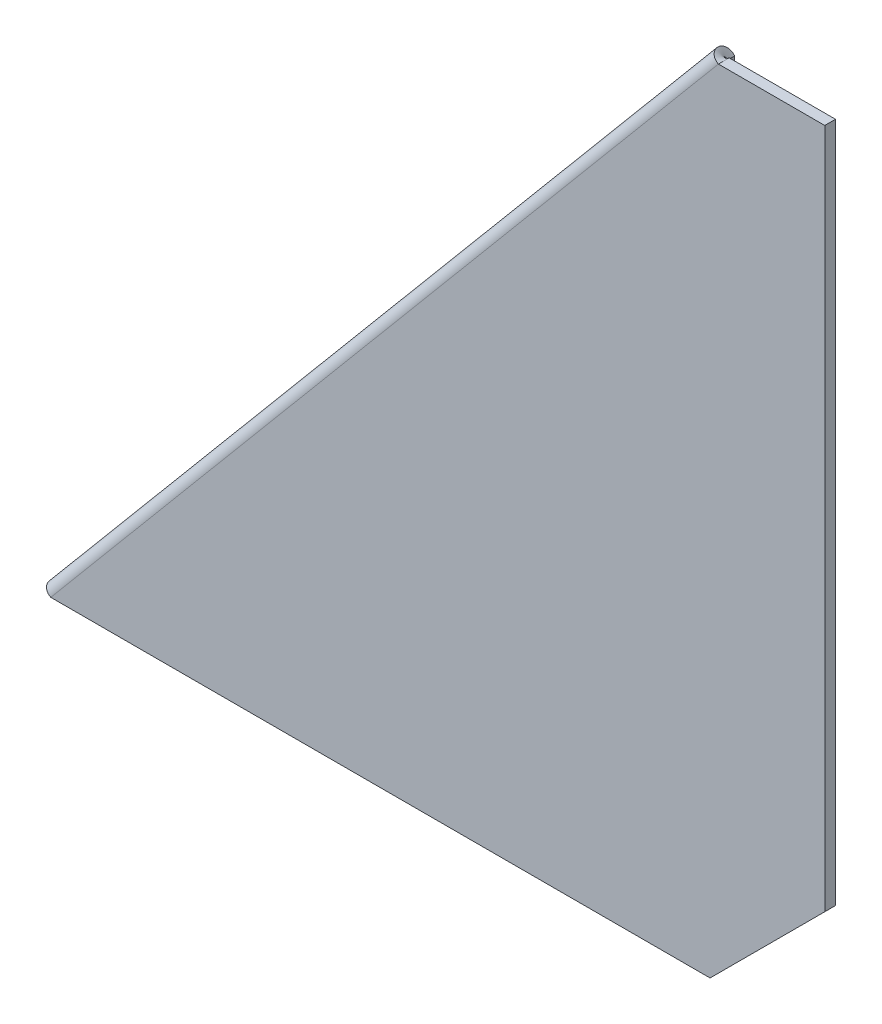
ISO-10303-21;
HEADER;
FILE_DESCRIPTION(('STEP AP214'),'2;1');
FILE_NAME('part.step','',(''),(''),'','','');
FILE_SCHEMA(('AUTOMOTIVE_DESIGN { 1 0 10303 214 1 1 1 1 }'));
ENDSEC;
DATA;
#1=APPLICATION_CONTEXT('core data for automotive mechanical design processes');
#2=APPLICATION_PROTOCOL_DEFINITION('international standard','automotive_design',2000,#1);
#3=PRODUCT_CONTEXT('',#1,'mechanical');
#4=PRODUCT('Part','Part','',(#3));
#5=PRODUCT_RELATED_PRODUCT_CATEGORY('part','',(#4));
#6=PRODUCT_DEFINITION_FORMATION('','',#4);
#7=PRODUCT_DEFINITION_CONTEXT('part definition',#1,'design');
#8=PRODUCT_DEFINITION('design','',#6,#7);
#9=PRODUCT_DEFINITION_SHAPE('','',#8);
#10=(LENGTH_UNIT() NAMED_UNIT(*) SI_UNIT(.MILLI.,.METRE.));
#11=(NAMED_UNIT(*) PLANE_ANGLE_UNIT() SI_UNIT($,.RADIAN.));
#12=(NAMED_UNIT(*) SI_UNIT($,.STERADIAN.) SOLID_ANGLE_UNIT());
#13=UNCERTAINTY_MEASURE_WITH_UNIT(LENGTH_MEASURE(1.E-05),#10,'distance_accuracy_value','');
#14=(GEOMETRIC_REPRESENTATION_CONTEXT(3) GLOBAL_UNCERTAINTY_ASSIGNED_CONTEXT((#13)) GLOBAL_UNIT_ASSIGNED_CONTEXT((#10,
#11,#12)) REPRESENTATION_CONTEXT('',''));
#15=CARTESIAN_POINT('',(0.,0.,0.));
#16=DIRECTION('',(0.,0.,1.));
#17=DIRECTION('',(1.,0.,0.));
#18=AXIS2_PLACEMENT_3D('',#15,#16,#17);
#19=CARTESIAN_POINT('',(0.,0.,1.5));
#20=DIRECTION('',(0.,-1.,0.));
#21=DIRECTION('',(0.,0.,1.));
#22=AXIS2_PLACEMENT_3D('',#19,#20,#21);
#23=PLANE('',#22);
#24=DIRECTION('',(1.,0.,0.));
#25=VECTOR('',#24,1.);
#26=CARTESIAN_POINT('',(0.,0.,0.));
#27=LINE('',#26,#25);
#28=CARTESIAN_POINT('',(-107.976618701535,0.,0.));
#29=VERTEX_POINT('',#28);
#30=CARTESIAN_POINT('',(-16.0000000000001,0.,0.));
#31=VERTEX_POINT('',#30);
#32=EDGE_CURVE('E227',#29,#31,#27,.T.);
#33=ORIENTED_EDGE('',*,*,#32,.T.);
#34=DIRECTION('',(0.,0.,-1.));
#35=VECTOR('',#34,1.);
#36=CARTESIAN_POINT('',(-16.0000000000001,0.,1.5));
#37=LINE('',#36,#35);
#38=CARTESIAN_POINT('',(-16.0000000000001,0.,1.5));
#39=VERTEX_POINT('',#38);
#40=EDGE_CURVE('E241',#39,#31,#37,.T.);
#41=ORIENTED_EDGE('',*,*,#40,.F.);
#42=DIRECTION('',(1.,0.,0.));
#43=VECTOR('',#42,1.);
#44=CARTESIAN_POINT('',(0.,0.,1.5));
#45=LINE('',#44,#43);
#46=CARTESIAN_POINT('',(-107.976618701535,2.77454309268463E-13,1.5));
#47=VERTEX_POINT('',#46);
#48=EDGE_CURVE('E230',#47,#39,#45,.T.);
#49=ORIENTED_EDGE('',*,*,#48,.F.);
#50=DIRECTION('',(-2.31211168845866E-13,1.94009206502636E-13,1.));
#51=VECTOR('',#50,1.);
#52=CARTESIAN_POINT('',(-107.976618701535,0.,0.));
#53=LINE('',#52,#51);
#54=CARTESIAN_POINT('',(-107.976618701534,0.,0.443328578028385));
#55=VERTEX_POINT('',#54);
#56=EDGE_CURVE('E267',#55,#47,#53,.T.);
#57=ORIENTED_EDGE('',*,*,#56,.F.);
#58=CARTESIAN_POINT('',(-109.471376447718,3.08106548036582E-09,-1.11679486033305));
#59=CARTESIAN_POINT('',(-109.456043246665,1.10776213599154E-09,-1.05502124776419));
#60=CARTESIAN_POINT('',(-109.439588755906,2.97175738733963E-10,-0.99349494468125));
#61=CARTESIAN_POINT('',(-109.403832264016,-2.97919454344668E-10,-0.871113234580684));
#62=CARTESIAN_POINT('',(-109.384523237662,-7.98545304207288E-11,-0.810259892629573));
#63=CARTESIAN_POINT('',(-109.342507340458,7.99177025969341E-11,-0.689665516691905));
#64=CARTESIAN_POINT('',(-109.319797806266,2.14072848196727E-11,-0.629925396211866));
#65=CARTESIAN_POINT('',(-109.270344467167,-2.13841776282341E-11,-0.512193415417915));
#66=CARTESIAN_POINT('',(-109.243605001931,-5.7445263054152E-12,-0.454199754052418));
#67=CARTESIAN_POINT('',(-109.185405854743,5.69839901709828E-12,-0.340683238414849));
#68=CARTESIAN_POINT('',(-109.153951730529,1.52485388128161E-12,-0.28515757342757));
#69=CARTESIAN_POINT('',(-109.085645196592,-1.52518472645757E-12,-0.177464626755962));
#70=CARTESIAN_POINT('',(-109.048790624923,-3.99551149622039E-13,-0.125298702162831));
#71=CARTESIAN_POINT('',(-108.969211057228,3.99998600009935E-13,-0.0255322147879435));
#72=CARTESIAN_POINT('',(-108.926483403254,0.,0.0220662642736512));
#73=CARTESIAN_POINT('',(-108.858062628056,0.,0.0889203475438293));
#74=CARTESIAN_POINT('',(-108.834550731901,0.,0.110435338665495));
#75=CARTESIAN_POINT('',(-108.786105433467,0.,0.151812560134708));
#76=CARTESIAN_POINT('',(-108.76117196171,0.,0.17167470958487));
#77=CARTESIAN_POINT('',(-108.70995910784,0.,0.209583815306673));
#78=CARTESIAN_POINT('',(-108.683679671517,0.,0.227630698377984));
#79=CARTESIAN_POINT('',(-108.629877253564,0.,0.261769379551459));
#80=CARTESIAN_POINT('',(-108.6023542347,0.,0.277861119059917));
#81=CARTESIAN_POINT('',(-108.546188819445,0.,0.307959283585154));
#82=CARTESIAN_POINT('',(-108.517546395464,0.,0.32196565716189));
#83=CARTESIAN_POINT('',(-108.459290780317,0.,0.347790859842684));
#84=CARTESIAN_POINT('',(-108.429677576611,0.,0.359609660673641));
#85=CARTESIAN_POINT('',(-108.36964498948,0.,0.380982922189746));
#86=CARTESIAN_POINT('',(-108.339225601077,-1.69701823971278E-13,0.390537368886266));
#87=CARTESIAN_POINT('',(-108.277747528608,1.6988827070512E-13,0.407312608183594));
#88=CARTESIAN_POINT('',(-108.246688840182,6.33815801237855E-13,0.414533384864611));
#89=CARTESIAN_POINT('',(-108.184119935866,-6.3360356114478E-13,0.426594328108947));
#90=CARTESIAN_POINT('',(-108.152609720151,-2.36494961009212E-12,0.431434495587485));
#91=CARTESIAN_POINT('',(-108.075149538531,3.42135485874894E-12,0.440356971259994));
#92=CARTESIAN_POINT('',(-108.029035312153,1.54147459592031E-11,0.443135525712058));
#93=CARTESIAN_POINT('',(-107.980841522269,1.41366502262928E-12,0.443328058032364));
#94=CARTESIAN_POINT('',(-107.978730061676,7.46943101310038E-13,0.443331046313084));
#95=CARTESIAN_POINT('',(-107.976618701534,0.,0.443328578028385));
#96=B_SPLINE_CURVE_WITH_KNOTS('',3,(#58,#59,#60,#61,#62,#63,#64,#65,#66,#67,#68,#69,#70,#71,#72,
#73,#74,#75,#76,#77,#78,#79,#80,#81,#82,#83,#84,#85,#86,#87,#88,#89,#90,#91,#92,#93,#94,#95),
.UNSPECIFIED.,.F.,.F.,(4,2,2,2,2,2,2,2,2,2,2,2,2,2,2,2,2,2,4),(0.,0.190979346243924,
0.38243678223421,0.574044963288549,0.765448264337195,0.956627684307973,1.14788384873928,
1.33922685564549,1.43477503120413,1.53032788056608,1.62588458153817,1.72144414554342,
1.81700606634085,1.91256922213409,2.00813296827785,2.10369736632301,2.19926172762867,
2.3375035308276,2.34383788559575),.UNSPECIFIED.);
#97=CARTESIAN_POINT('',(-109.466807066608,0.,-1.09850484920981));
#98=VERTEX_POINT('',#97);
#99=EDGE_CURVE('E140',#98,#55,#96,.T.);
#100=ORIENTED_EDGE('',*,*,#99,.F.);
#101=CARTESIAN_POINT('',(-107.976618701535,0.,-0.05));
#102=DIRECTION('',(0.,-1.,0.));
#103=DIRECTION('',(-1.,0.,0.));
#104=AXIS2_PLACEMENT_3D('',#101,#102,#103);
#105=ELLIPSE('',#104,2.02338129846504,1.55);
#106=CARTESIAN_POINT('',(-107.976618701535,0.,-1.6));
#107=VERTEX_POINT('',#106);
#108=EDGE_CURVE('E120',#107,#98,#105,.F.);
#109=ORIENTED_EDGE('',*,*,#108,.F.);
#110=DIRECTION('',(1.,0.,0.));
#111=VECTOR('',#110,1.);
#112=CARTESIAN_POINT('',(-109.710827640715,0.,-1.6));
#113=LINE('',#112,#111);
#114=CARTESIAN_POINT('',(-98.2513343960094,0.,-1.6));
#115=VERTEX_POINT('',#114);
#116=EDGE_CURVE('E130',#107,#115,#113,.T.);
#117=ORIENTED_EDGE('',*,*,#116,.T.);
#118=DIRECTION('',(0.,0.,1.));
#119=VECTOR('',#118,1.);
#120=CARTESIAN_POINT('',(-98.2513343960094,0.,-1.6));
#121=LINE('',#120,#119);
#122=CARTESIAN_POINT('',(-98.2513343960094,0.,-0.1));
#123=VERTEX_POINT('',#122);
#124=EDGE_CURVE('E141',#123,#115,#121,.F.);
#125=ORIENTED_EDGE('',*,*,#124,.F.);
#126=DIRECTION('',(-1.,0.,0.));
#127=VECTOR('',#126,1.);
#128=CARTESIAN_POINT('',(-59.3890860322079,0.,-0.1));
#129=LINE('',#128,#127);
#130=CARTESIAN_POINT('',(-107.976618701535,0.,-0.1));
#131=VERTEX_POINT('',#130);
#132=EDGE_CURVE('E136',#123,#131,#129,.T.);
#133=ORIENTED_EDGE('',*,*,#132,.T.);
#134=CARTESIAN_POINT('',(-107.976618701535,0.,-0.05));
#135=DIRECTION('',(0.,-1.,0.));
#136=DIRECTION('',(-1.,0.,0.));
#137=AXIS2_PLACEMENT_3D('',#134,#135,#136);
#138=ELLIPSE('',#137,0.0652703644666142,0.05);
#139=EDGE_CURVE('E11',#131,#29,#138,.F.);
#140=ORIENTED_EDGE('',*,*,#139,.T.);
#141=EDGE_LOOP('',(#33,#41,#49,#57,#100,#109,#117,#125,#133,#140));
#142=FACE_BOUND('',#141,.T.);
#143=ADVANCED_FACE('F39',(#142),#23,.T.);
#144=CARTESIAN_POINT('',(0.,111.,1.5));
#145=DIRECTION('',(1.,0.,0.));
#146=DIRECTION('',(0.,1.,0.));
#147=AXIS2_PLACEMENT_3D('',#144,#145,#146);
#148=PLANE('',#147);
#149=DIRECTION('',(0.,1.,0.));
#150=VECTOR('',#149,1.);
#151=CARTESIAN_POINT('',(0.,111.,0.));
#152=LINE('',#151,#150);
#153=CARTESIAN_POINT('',(0.,16.0000000000001,0.));
#154=VERTEX_POINT('',#153);
#155=CARTESIAN_POINT('',(0.,111.,0.));
#156=VERTEX_POINT('',#155);
#157=EDGE_CURVE('E220',#154,#156,#152,.T.);
#158=ORIENTED_EDGE('',*,*,#157,.T.);
#159=DIRECTION('',(0.,0.,-1.));
#160=VECTOR('',#159,1.);
#161=CARTESIAN_POINT('',(0.,111.,1.5));
#162=LINE('',#161,#160);
#163=CARTESIAN_POINT('',(0.,111.,1.5));
#164=VERTEX_POINT('',#163);
#165=EDGE_CURVE('E232',#164,#156,#162,.T.);
#166=ORIENTED_EDGE('',*,*,#165,.F.);
#167=DIRECTION('',(0.,1.,0.));
#168=VECTOR('',#167,1.);
#169=CARTESIAN_POINT('',(0.,111.,1.5));
#170=LINE('',#169,#168);
#171=CARTESIAN_POINT('',(0.,16.0000000000001,1.5));
#172=VERTEX_POINT('',#171);
#173=EDGE_CURVE('E224',#172,#164,#170,.T.);
#174=ORIENTED_EDGE('',*,*,#173,.F.);
#175=DIRECTION('',(0.,0.,1.));
#176=VECTOR('',#175,1.);
#177=CARTESIAN_POINT('',(0.,16.0000000000001,1.5));
#178=LINE('',#177,#176);
#179=EDGE_CURVE('E245',#154,#172,#178,.T.);
#180=ORIENTED_EDGE('',*,*,#179,.F.);
#181=EDGE_LOOP('',(#158,#166,#174,#180));
#182=FACE_BOUND('',#181,.T.);
#183=ADVANCED_FACE('F260',(#182),#148,.T.);
#184=CARTESIAN_POINT('',(-16.8599409393209,111.,1.5));
#185=DIRECTION('',(0.,1.,0.));
#186=DIRECTION('',(0.,0.,-1.));
#187=AXIS2_PLACEMENT_3D('',#184,#185,#186);
#188=PLANE('',#187);
#189=DIRECTION('',(-2.31211168845866E-13,1.94009206502636E-13,1.));
#190=VECTOR('',#189,1.);
#191=CARTESIAN_POINT('',(-14.8365596408559,111.,0.));
#192=LINE('',#191,#190);
#193=CARTESIAN_POINT('',(-14.8365596408559,111.,0.));
#194=VERTEX_POINT('',#193);
#195=CARTESIAN_POINT('',(-14.8365596408562,111.,1.5));
#196=VERTEX_POINT('',#195);
#197=EDGE_CURVE('E214',#194,#196,#192,.T.);
#198=ORIENTED_EDGE('',*,*,#197,.T.);
#199=DIRECTION('',(-1.,0.,0.));
#200=VECTOR('',#199,1.);
#201=CARTESIAN_POINT('',(-16.8599409393209,111.,1.5));
#202=LINE('',#201,#200);
#203=EDGE_CURVE('E226',#164,#196,#202,.T.);
#204=ORIENTED_EDGE('',*,*,#203,.F.);
#205=ORIENTED_EDGE('',*,*,#165,.T.);
#206=DIRECTION('',(-1.,0.,0.));
#207=VECTOR('',#206,1.);
#208=CARTESIAN_POINT('',(-16.8599409393209,111.,0.));
#209=LINE('',#208,#207);
#210=EDGE_CURVE('E235',#156,#194,#209,.T.);
#211=ORIENTED_EDGE('',*,*,#210,.T.);
#212=EDGE_LOOP('',(#198,#204,#205,#211));
#213=FACE_BOUND('',#212,.T.);
#214=ADVANCED_FACE('F265',(#213),#188,.T.);
#215=CARTESIAN_POINT('',(0.,0.,1.5));
#216=DIRECTION('',(0.,0.,1.));
#217=DIRECTION('',(-1.,0.,0.));
#218=AXIS2_PLACEMENT_3D('',#215,#216,#217);
#219=PLANE('',#218);
#220=DIRECTION('',(-0.642787609686543,-0.766044443118975,0.));
#221=VECTOR('',#220,1.);
#222=CARTESIAN_POINT('',(-108.812631113166,-0.99632079501387,1.5));
#223=LINE('',#222,#221);
#224=EDGE_CURVE('E187',#47,#196,#223,.F.);
#225=ORIENTED_EDGE('',*,*,#224,.F.);
#226=ORIENTED_EDGE('',*,*,#48,.T.);
#227=DIRECTION('',(0.707106781186548,0.707106781186548,0.));
#228=VECTOR('',#227,1.);
#229=CARTESIAN_POINT('',(-8.00000000000006,8.00000000000006,1.5));
#230=LINE('',#229,#228);
#231=EDGE_CURVE('E47',#172,#39,#230,.F.);
#232=ORIENTED_EDGE('',*,*,#231,.F.);
#233=ORIENTED_EDGE('',*,*,#173,.T.);
#234=ORIENTED_EDGE('',*,*,#203,.T.);
#235=EDGE_LOOP('',(#225,#226,#232,#233,#234));
#236=FACE_BOUND('',#235,.T.);
#237=ADVANCED_FACE('F252',(#236),#219,.T.);
#238=CARTESIAN_POINT('',(0.,0.,0.));
#239=DIRECTION('',(0.,0.,1.));
#240=DIRECTION('',(-1.,0.,0.));
#241=AXIS2_PLACEMENT_3D('',#238,#239,#240);
#242=PLANE('',#241);
#243=ORIENTED_EDGE('',*,*,#210,.F.);
#244=ORIENTED_EDGE('',*,*,#157,.F.);
#245=DIRECTION('',(-0.707106781186548,-0.707106781186548,0.));
#246=VECTOR('',#245,1.);
#247=CARTESIAN_POINT('',(-16.0000000000001,0.,0.));
#248=LINE('',#247,#246);
#249=EDGE_CURVE('E244',#31,#154,#248,.F.);
#250=ORIENTED_EDGE('',*,*,#249,.F.);
#251=ORIENTED_EDGE('',*,*,#32,.F.);
#252=DIRECTION('',(-0.642787609686543,-0.766044443118975,0.));
#253=VECTOR('',#252,1.);
#254=CARTESIAN_POINT('',(-108.812631113166,-0.996320795014141,0.));
#255=LINE('',#254,#253);
#256=EDGE_CURVE('E54',#29,#194,#255,.F.);
#257=ORIENTED_EDGE('',*,*,#256,.T.);
#258=EDGE_LOOP('',(#243,#244,#250,#251,#257));
#259=FACE_BOUND('',#258,.T.);
#260=ADVANCED_FACE('F257',(#259),#242,.F.);
#261=CARTESIAN_POINT('',(-16.0000000000001,0.,1.5));
#262=DIRECTION('',(-0.707106781186547,0.707106781186547,0.));
#263=DIRECTION('',(0.,0.,-1.));
#264=AXIS2_PLACEMENT_3D('',#261,#262,#263);
#265=PLANE('',#264);
#266=ORIENTED_EDGE('',*,*,#231,.T.);
#267=ORIENTED_EDGE('',*,*,#40,.T.);
#268=ORIENTED_EDGE('',*,*,#249,.T.);
#269=ORIENTED_EDGE('',*,*,#179,.T.);
#270=EDGE_LOOP('',(#266,#267,#268,#269));
#271=FACE_BOUND('',#270,.T.);
#272=ADVANCED_FACE('F41',(#271),#265,.F.);
#273=CARTESIAN_POINT('',(-56.5355704815897,49.7149115128211,-1.6));
#274=DIRECTION('',(-0.766044443118975,0.642787609686543,0.));
#275=DIRECTION('',(-0.642787609686543,-0.766044443118975,0.));
#276=AXIS2_PLACEMENT_3D('',#273,#274,#275);
#277=PLANE('',#276);
#278=ORIENTED_EDGE('',*,*,#124,.T.);
#279=DIRECTION('',(-0.642787609686543,-0.766044443118975,0.));
#280=VECTOR('',#279,1.);
#281=CARTESIAN_POINT('',(-56.5355704815897,49.7149115128211,-1.6));
#282=LINE('',#281,#280);
#283=CARTESIAN_POINT('',(-15.6725720524865,98.4135366948759,-1.6));
#284=VERTEX_POINT('',#283);
#285=EDGE_CURVE('E126',#284,#115,#282,.T.);
#286=ORIENTED_EDGE('',*,*,#285,.F.);
#287=DIRECTION('',(0.,0.,-1.));
#288=VECTOR('',#287,1.);
#289=CARTESIAN_POINT('',(-15.6725720524865,98.4135366948759,1.60248477930515));
#290=LINE('',#289,#288);
#291=CARTESIAN_POINT('',(-15.6725720524865,98.4135366948759,-0.1));
#292=VERTEX_POINT('',#291);
#293=EDGE_CURVE('E272',#292,#284,#290,.T.);
#294=ORIENTED_EDGE('',*,*,#293,.F.);
#295=DIRECTION('',(-0.642787609686543,-0.766044443118975,0.));
#296=VECTOR('',#295,1.);
#297=CARTESIAN_POINT('',(-56.5355704815897,49.7149115128211,-0.1));
#298=LINE('',#297,#296);
#299=EDGE_CURVE('E127',#292,#123,#298,.T.);
#300=ORIENTED_EDGE('',*,*,#299,.T.);
#301=EDGE_LOOP('',(#278,#286,#294,#300));
#302=FACE_BOUND('',#301,.T.);
#303=ADVANCED_FACE('F286',(#302),#277,.F.);
#304=CARTESIAN_POINT('',(-59.3890860322079,52.1092953589035,-1.6));
#305=DIRECTION('',(0.,0.,-1.));
#306=DIRECTION('',(1.,0.,0.));
#307=AXIS2_PLACEMENT_3D('',#304,#305,#306);
#308=PLANE('',#307);
#309=ORIENTED_EDGE('',*,*,#116,.F.);
#310=DIRECTION('',(0.642787609686543,0.766044443118975,0.));
#311=VECTOR('',#310,1.);
#312=CARTESIAN_POINT('',(-62.2426015828261,54.5036792049859,-1.6));
#313=LINE('',#312,#311);
#314=CARTESIAN_POINT('',(-15.6725720524865,110.003679204986,-1.6));
#315=VERTEX_POINT('',#314);
#316=EDGE_CURVE('E116',#107,#315,#313,.T.);
#317=ORIENTED_EDGE('',*,*,#316,.T.);
#318=DIRECTION('',(0.,-1.,0.));
#319=VECTOR('',#318,1.);
#320=CARTESIAN_POINT('',(-15.6725720524865,110.003679204986,-1.6));
#321=LINE('',#320,#319);
#322=EDGE_CURVE('E275',#315,#284,#321,.T.);
#323=ORIENTED_EDGE('',*,*,#322,.T.);
#324=ORIENTED_EDGE('',*,*,#285,.T.);
#325=EDGE_LOOP('',(#309,#317,#323,#324));
#326=FACE_BOUND('',#325,.T.);
#327=ADVANCED_FACE('F131',(#326),#308,.T.);
#328=CARTESIAN_POINT('',(-59.3890860322079,52.1092953589035,-0.1));
#329=DIRECTION('',(0.,0.,-1.));
#330=DIRECTION('',(1.,0.,0.));
#331=AXIS2_PLACEMENT_3D('',#328,#329,#330);
#332=PLANE('',#331);
#333=ORIENTED_EDGE('',*,*,#299,.F.);
#334=DIRECTION('',(0.,1.,0.));
#335=VECTOR('',#334,1.);
#336=CARTESIAN_POINT('',(-15.6725720524865,110.003679204986,-0.1));
#337=LINE('',#336,#335);
#338=CARTESIAN_POINT('',(-15.6725720524865,110.003679204986,-0.1));
#339=VERTEX_POINT('',#338);
#340=EDGE_CURVE('E143',#292,#339,#337,.T.);
#341=ORIENTED_EDGE('',*,*,#340,.T.);
#342=DIRECTION('',(0.642787609686543,0.766044443118975,0.));
#343=VECTOR('',#342,1.);
#344=CARTESIAN_POINT('',(-62.2426015828261,54.5036792049859,-0.1));
#345=LINE('',#344,#343);
#346=EDGE_CURVE('E206',#131,#339,#345,.T.);
#347=ORIENTED_EDGE('',*,*,#346,.F.);
#348=ORIENTED_EDGE('',*,*,#132,.F.);
#349=EDGE_LOOP('',(#333,#341,#347,#348));
#350=FACE_BOUND('',#349,.T.);
#351=ADVANCED_FACE('F279',(#350),#332,.F.);
#352=CARTESIAN_POINT('',(-14.8365596408559,111.,1.515));
#353=CARTESIAN_POINT('',(-15.0283561782359,111.090181943651,1.515));
#354=CARTESIAN_POINT('',(-15.2200262935927,111.180281851774,1.47426723898592));
#355=CARTESIAN_POINT('',(-15.5796634687264,111.34056839768,1.31747569777442));
#356=CARTESIAN_POINT('',(-15.7474840995814,111.410644189582,1.20147860835318));
#357=CARTESIAN_POINT('',(-16.0390848278593,111.513841378025,0.911765616760767));
#358=CARTESIAN_POINT('',(-16.1627776041131,111.546889503405,0.738163704280497));
#359=CARTESIAN_POINT('',(-16.3525545939554,111.564646430482,0.359635439022296));
#360=CARTESIAN_POINT('',(-16.4185915496678,111.549315578111,0.15485802095284));
#361=CARTESIAN_POINT('',(-16.488259250637,111.466288845193,-0.25485802095284));
#362=CARTESIAN_POINT('',(-16.4918899958939,111.398592964646,-0.459635439022297));
#363=CARTESIAN_POINT('',(-16.4414484079899,111.214782571734,-0.838163704280497));
#364=CARTESIAN_POINT('',(-16.3874233327054,111.098707713436,-1.01176561676077));
#365=CARTESIAN_POINT('',(-16.2351580063659,110.829457059157,-1.30147860835318));
#366=CARTESIAN_POINT('',(-16.1370050764802,110.676354534338,-1.41747569777442));
#367=CARTESIAN_POINT('',(-15.9167033032849,110.350014522596,-1.57426723898592));
#368=CARTESIAN_POINT('',(-15.7946890489747,110.176901991825,-1.615));
#369=CARTESIAN_POINT('',(-15.6725720524865,110.003679204986,-1.615));
#370=CARTESIAN_POINT('',(-14.8365596408559,111.,1.5));
#371=CARTESIAN_POINT('',(-15.0268517343304,111.088919682545,1.5));
#372=CARTESIAN_POINT('',(-15.217018635908,111.17775812732,1.45965764883589));
#373=CARTESIAN_POINT('',(-15.573876550906,111.335712597072,1.3043689019491));
#374=CARTESIAN_POINT('',(-15.7404225480833,111.404718844324,1.1894836057172));
#375=CARTESIAN_POINT('',(-16.0298961227448,111.506131138952,0.902547415961143));
#376=CARTESIAN_POINT('',(-16.152737216004,111.538464617446,0.730609419574933));
#377=CARTESIAN_POINT('',(-16.3413629986048,111.555255566951,0.355709220756907));
#378=CARTESIAN_POINT('',(-16.407100883021,111.539673763966,0.152894525544347));
#379=CARTESIAN_POINT('',(-16.4767685839902,111.456647031048,-0.252894525544347));
#380=CARTESIAN_POINT('',(-16.4806984005432,111.389202101115,-0.455709220756907));
#381=CARTESIAN_POINT('',(-16.4314080198809,111.206357685775,-0.830609419574933));
#382=CARTESIAN_POINT('',(-16.3782346275909,111.090997474363,-1.00254741596114));
#383=CARTESIAN_POINT('',(-16.2280964548678,110.823531713899,-1.2894836057172));
#384=CARTESIAN_POINT('',(-16.1312181586597,110.671498733729,-1.4043689019491));
#385=CARTESIAN_POINT('',(-15.9136956456002,110.347490798142,-1.55965764883589));
#386=CARTESIAN_POINT('',(-15.7931847205083,110.175639593144,-1.6));
#387=CARTESIAN_POINT('',(-15.6725720524865,110.003679204986,-1.6));
#388=CARTESIAN_POINT('',(-14.8365596408559,111.,0.));
#389=CARTESIAN_POINT('',(-14.8764073437848,110.962693571907,0.));
#390=CARTESIAN_POINT('',(-14.9162528674407,110.925385681929,-0.00130136616658422));
#391=CARTESIAN_POINT('',(-14.9951847688624,110.850132536194,-0.00631068058228711));
#392=CARTESIAN_POINT('',(-15.0342673982726,110.812184318564,-0.010016657880091));
#393=CARTESIAN_POINT('',(-15.1110256112964,110.735107231696,-0.0192726640012543));
#394=CARTESIAN_POINT('',(-15.1486984050963,110.695976021526,-0.024819050981455));
#395=CARTESIAN_POINT('',(-15.2222034635376,110.616169213848,-0.036912605782036));
#396=CARTESIAN_POINT('',(-15.2580342183425,110.575492349436,-0.0434550153050213));
#397=CARTESIAN_POINT('',(-15.3277019193117,110.492465616518,-0.0565449846949788));
#398=CARTESIAN_POINT('',(-15.361538865476,110.450115748012,-0.063087394217964));
#399=CARTESIAN_POINT('',(-15.4273692089732,110.363869089855,-0.075180949018545));
#400=CARTESIAN_POINT('',(-15.4593641161425,110.319973567107,-0.0807273359987458));
#401=CARTESIAN_POINT('',(-15.5219413050572,110.230997188139,-0.0899833421199091));
#402=CARTESIAN_POINT('',(-15.5525263766162,110.185918672851,-0.0936893194177129));
#403=CARTESIAN_POINT('',(-15.6129298771329,110.09511835275,-0.0986986338334158));
#404=CARTESIAN_POINT('',(-15.6427518738615,110.049399725023,-0.1));
#405=CARTESIAN_POINT('',(-15.6725720524865,110.003679204986,-0.1));
#406=B_SPLINE_SURFACE_WITH_KNOTS('',1,3,((#352,#353,#354,#355,#356,#357,#358,#359,#360,#361,
#362,#363,#364,#365,#366,#367,#368,#369),(#370,#371,#372,#373,#374,#375,#376,#377,#378,#379,
#380,#381,#382,#383,#384,#385,#386,#387),(#388,#389,#390,#391,#392,#393,#394,#395,#396,#397,
#398,#399,#400,#401,#402,#403,#404,#405)),.UNSPECIFIED.,.F.,.F.,.F.,(2,1,2),(4,2,2,2,2,2,2,2,4),
(-0.01,0.,1.),(0.,0.125,0.25,0.375,0.5,0.625,0.75,0.875,1.),.UNSPECIFIED.);
#407=DIRECTION('',(0.,0.,-1.));
#408=VECTOR('',#407,1.);
#409=CARTESIAN_POINT('',(-15.6725720524865,110.003679204986,-1.6));
#410=LINE('',#409,#408);
#411=EDGE_CURVE('E218',#339,#315,#410,.T.);
#412=CARTESIAN_POINT('',(-14.8365596408559,111.,1.5));
#413=CARTESIAN_POINT('',(-14.8806649698178,111.020608396703,1.49999971308944));
#414=CARTESIAN_POINT('',(-14.9247464340228,111.041206550204,1.49785762616923));
#415=CARTESIAN_POINT('',(-15.012610402817,111.082153151759,1.4893155893033));
#416=CARTESIAN_POINT('',(-15.0563929145817,111.102501605815,1.48291574192097));
#417=CARTESIAN_POINT('',(-15.1867313779252,111.162743667712,1.45740461058199));
#418=CARTESIAN_POINT('',(-15.2724699744505,111.20192451504,1.43198147631419));
#419=CARTESIAN_POINT('',(-15.435961292263,111.27488704852,1.36645399527638));
#420=CARTESIAN_POINT('',(-15.5138951177712,111.308819822755,1.32696170206114));
#421=CARTESIAN_POINT('',(-15.6635491295384,111.371477607576,1.23442145284186));
#422=CARTESIAN_POINT('',(-15.7352710571656,111.400204080116,1.18137731237497));
#423=CARTESIAN_POINT('',(-15.8707999245554,111.451011795912,1.0633425245791));
#424=CARTESIAN_POINT('',(-15.9346066189663,111.473092833206,0.998351507082643));
#425=CARTESIAN_POINT('',(-16.0528454687104,111.509387527096,0.858386142076574));
#426=CARTESIAN_POINT('',(-16.1072759313472,111.523599764156,0.783409996268863));
#427=CARTESIAN_POINT('',(-16.2055629880112,111.543148947445,0.625771029706526));
#428=CARTESIAN_POINT('',(-16.249420195739,111.548486408897,0.54310865546773));
#429=CARTESIAN_POINT('',(-16.3256962164483,111.549569241968,0.37261238201898));
#430=CARTESIAN_POINT('',(-16.3581157772725,111.545315240853,0.284778821361854));
#431=CARTESIAN_POINT('',(-16.4110090129939,111.526779937704,0.106605542922367));
#432=CARTESIAN_POINT('',(-16.4314823241106,111.512498330345,0.0162657489093007));
#433=CARTESIAN_POINT('',(-16.4603284627713,111.473782507928,-0.164170124233372));
#434=CARTESIAN_POINT('',(-16.468701262951,111.449348269912,-0.254266202811376));
#435=CARTESIAN_POINT('',(-16.4735628742149,111.390509332847,-0.431470939225778));
#436=CARTESIAN_POINT('',(-16.4700520306802,111.356104923593,-0.518579683810441));
#437=CARTESIAN_POINT('',(-16.4517260158836,111.277807074941,-0.687166947607544));
#438=CARTESIAN_POINT('',(-16.4369102294066,111.233913119214,-0.768645160143149));
#439=CARTESIAN_POINT('',(-16.3968916544974,111.137411464366,-0.923491481300269));
#440=CARTESIAN_POINT('',(-16.371688434696,111.084803403419,-0.996859252950911));
#441=CARTESIAN_POINT('',(-16.3121421557457,110.971918157992,-1.13323798394309));
#442=CARTESIAN_POINT('',(-16.277800351778,110.911642027312,-1.19625036367282));
#443=CARTESIAN_POINT('',(-16.2014837823789,110.784688979713,-1.31001564554011));
#444=CARTESIAN_POINT('',(-16.1595089657465,110.71801201986,-1.36076846543733));
#445=CARTESIAN_POINT('',(-16.0696798208804,110.57971844586,-1.44847454455457));
#446=CARTESIAN_POINT('',(-16.0218247547618,110.508101212277,-1.48542606956004));
#447=CARTESIAN_POINT('',(-15.9244875302639,110.364976600984,-1.54301026661197));
#448=CARTESIAN_POINT('',(-15.8751879181771,110.293622652982,-1.56432905562861));
#449=CARTESIAN_POINT('',(-15.7999112172911,110.185498691279,-1.58570209712035));
#450=CARTESIAN_POINT('',(-15.7745831855843,110.14925455418,-1.59105894436939));
#451=CARTESIAN_POINT('',(-15.723697613301,110.076571897206,-1.59820813543985));
#452=CARTESIAN_POINT('',(-15.6981400543286,110.040133361848,-1.60000019094614));
#453=CARTESIAN_POINT('',(-15.6725720524865,110.003679204986,-1.6));
#454=B_SPLINE_CURVE_WITH_KNOTS('',3,(#412,#413,#414,#415,#416,#417,#418,#419,#420,#421,#422,
#423,#424,#425,#426,#427,#428,#429,#430,#431,#432,#433,#434,#435,#436,#437,#438,#439,#440,#441,
#442,#443,#444,#445,#446,#447,#448,#449,#450,#451,#452,#453),.UNSPECIFIED.,.F.,.F.,(4,2,2,2,2,2,
2,2,2,2,2,2,2,2,2,2,2,2,2,2,4),(0.,0.145948887947926,0.291894260321612,0.583157694213013,
0.863047563535473,1.14285871624226,1.42267854020718,1.70254882738596,1.98240286621449,
2.262238603586,2.54208286191781,2.82192775309336,3.10176451104722,3.38161649880875,
3.66148010943455,3.94130530071745,4.22113236908881,4.50099458757098,4.7676867906339,
4.90118278071971,5.03468956732608),.UNSPECIFIED.);
#455=EDGE_CURVE('E123',#196,#315,#454,.T.);
#456=CARTESIAN_POINT('',(-14.8365596408559,111.,0.));
#457=CARTESIAN_POINT('',(-14.8764274203451,110.962710601512,6.57758902017014E-05));
#458=CARTESIAN_POINT('',(-14.9162590768036,110.925390892203,-0.00128407255946689));
#459=CARTESIAN_POINT('',(-14.9951785594995,110.85012732592,-0.00632797418940447));
#460=CARTESIAN_POINT('',(-15.0342663857371,110.812183468946,-0.0100220273696735));
#461=CARTESIAN_POINT('',(-15.111026623832,110.735108081314,-0.0192672945116722));
#462=CARTESIAN_POINT('',(-15.1486990356893,110.695976550656,-0.024818508473402));
#463=CARTESIAN_POINT('',(-15.2222028329446,110.616168684717,-0.0369131482900883));
#464=CARTESIAN_POINT('',(-15.2580342183425,110.575492349436,-0.0434565741450445));
#465=CARTESIAN_POINT('',(-15.3277019193117,110.492465616518,-0.0565434258549561));
#466=CARTESIAN_POINT('',(-15.361538234883,110.450115218882,-0.0630868517099115));
#467=CARTESIAN_POINT('',(-15.4273698395662,110.363869618985,-0.0751814915265972));
#468=CARTESIAN_POINT('',(-15.4593651286781,110.319974416725,-0.0807327054883277));
#469=CARTESIAN_POINT('',(-15.5219402925216,110.230996338521,-0.089977972630327));
#470=CARTESIAN_POINT('',(-15.5525201672533,110.185913462577,-0.0936720258105958));
#471=CARTESIAN_POINT('',(-15.6129360864958,110.095123563024,-0.0987159274405332));
#472=CARTESIAN_POINT('',(-15.6427721310065,110.049416539416,-0.100065775890202));
#473=CARTESIAN_POINT('',(-15.6725720524865,110.003679204986,-0.1));
#474=B_SPLINE_CURVE_WITH_KNOTS('',3,(#456,#457,#458,#459,#460,#461,#462,#463,#464,#465,#466,
#467,#468,#469,#470,#471,#472,#473),.UNSPECIFIED.,.F.,.F.,(4,2,2,2,2,2,2,2,4),(0.,
0.163741909560362,0.327483819120726,0.491225728681107,0.654967638241469,0.818709547801846,
0.982451457362212,1.14619336692258,1.30993527648295),.UNSPECIFIED.);
#475=EDGE_CURVE('E188',#194,#339,#474,.T.);
#476=ORIENTED_EDGE('',*,*,#411,.T.);
#477=ORIENTED_EDGE('',*,*,#455,.F.);
#478=ORIENTED_EDGE('',*,*,#197,.F.);
#479=ORIENTED_EDGE('',*,*,#475,.T.);
#480=EDGE_LOOP('',(#476,#477,#478,#479));
#481=FACE_BOUND('',#480,.T.);
#482=ADVANCED_FACE('F165',(#481),#406,.T.);
#483=CARTESIAN_POINT('',(-108.812631113165,-0.996320795014241,-1.615));
#484=CARTESIAN_POINT('',(-108.934748109653,-0.823098008175686,-1.61500000000002));
#485=CARTESIAN_POINT('',(-109.056762363964,-0.649985477404213,-1.57426723898588));
#486=CARTESIAN_POINT('',(-109.277064137159,-0.323645465662296,-1.41747569777438));
#487=CARTESIAN_POINT('',(-109.375217067045,-0.170542940843316,-1.30147860835329));
#488=CARTESIAN_POINT('',(-109.527482393384,0.0987077134353797,-1.01176561676093));
#489=CARTESIAN_POINT('',(-109.581507468669,0.214782571733986,-0.838163704280713));
#490=CARTESIAN_POINT('',(-109.631949056573,0.398592964646294,-0.459635439022524));
#491=CARTESIAN_POINT('',(-109.628318311316,0.466288845193414,-0.254858020953033));
#492=CARTESIAN_POINT('',(-109.558650610347,0.549315578111299,0.154858020952602));
#493=CARTESIAN_POINT('',(-109.492613654635,0.564646430482051,0.359635439022111));
#494=CARTESIAN_POINT('',(-109.302836664792,0.546889503405502,0.738163704280353));
#495=CARTESIAN_POINT('',(-109.179143888539,0.513841378024835,0.911765616760441));
#496=CARTESIAN_POINT('',(-108.887543160261,0.41064418958193,1.20147860835289));
#497=CARTESIAN_POINT('',(-108.719722529406,0.340568397680529,1.31747569777432));
#498=CARTESIAN_POINT('',(-108.360085354272,0.180281851774284,1.47426723898586));
#499=CARTESIAN_POINT('',(-108.168415238915,0.0901819436513936,1.51499999999996));
#500=CARTESIAN_POINT('',(-107.976618701535,1.77172330806384E-13,1.515));
#501=CARTESIAN_POINT('',(-108.812631113165,-0.99632079501424,-1.6));
#502=CARTESIAN_POINT('',(-108.933243781187,-0.824360406856882,-1.60000000000002));
#503=CARTESIAN_POINT('',(-109.053754706279,-0.652509201858131,-1.55965764883586));
#504=CARTESIAN_POINT('',(-109.271277219339,-0.328501266271077,-1.40436890194906));
#505=CARTESIAN_POINT('',(-109.368155515547,-0.176468286100916,-1.28948360571732));
#506=CARTESIAN_POINT('',(-109.51829368827,0.0909974743628199,-1.0025474159613));
#507=CARTESIAN_POINT('',(-109.57146708056,0.206357685774784,-0.830609419575147));
#508=CARTESIAN_POINT('',(-109.620757461222,0.38920210111526,-0.455709220757132));
#509=CARTESIAN_POINT('',(-109.616827644669,0.456647031048116,-0.252894525544537));
#510=CARTESIAN_POINT('',(-109.5471599437,0.539673763966,0.15289452554411));
#511=CARTESIAN_POINT('',(-109.481422059284,0.555255566951016,0.355709220756723));
#512=CARTESIAN_POINT('',(-109.292796276683,0.538464617446299,0.73060941957479));
#513=CARTESIAN_POINT('',(-109.169955183424,0.506131138952273,0.90254741596082));
#514=CARTESIAN_POINT('',(-108.880481608763,0.404718844324327,1.18948360571692));
#515=CARTESIAN_POINT('',(-108.713935611585,0.335712597071747,1.30436890194901));
#516=CARTESIAN_POINT('',(-108.357077696587,0.177758127320366,1.45965764883584));
#517=CARTESIAN_POINT('',(-108.16691079501,0.0889196825450169,1.49999999999996));
#518=CARTESIAN_POINT('',(-107.976618701535,1.75350871156609E-13,1.5));
#519=CARTESIAN_POINT('',(-108.812631113166,-0.996320795014154,-0.1));
#520=CARTESIAN_POINT('',(-108.782810934541,-0.950600274976491,-0.100000000000001));
#521=CARTESIAN_POINT('',(-108.752988937812,-0.904881647249918,-0.0986986338334171));
#522=CARTESIAN_POINT('',(-108.692585437295,-0.814081327149195,-0.0936893194177156));
#523=CARTESIAN_POINT('',(-108.662000365736,-0.769002811860873,-0.0899833421199124));
#524=CARTESIAN_POINT('',(-108.599423176822,-0.680026432893161,-0.0807273359987505));
#525=CARTESIAN_POINT('',(-108.567428269652,-0.63613091014543,-0.0751809490185503));
#526=CARTESIAN_POINT('',(-108.501597926155,-0.549884251988146,-0.0630873942179703));
#527=CARTESIAN_POINT('',(-108.467760979991,-0.507534383481678,-0.0565449846949854));
#528=CARTESIAN_POINT('',(-108.398093279022,-0.424507650563832,-0.0434550153050284));
#529=CARTESIAN_POINT('',(-108.362262524217,-0.383830786152454,-0.0369126057820431));
#530=CARTESIAN_POINT('',(-108.288757465775,-0.304023978474046,-0.0248190509814618));
#531=CARTESIAN_POINT('',(-108.251084671976,-0.264892768303931,-0.0192726640012606));
#532=CARTESIAN_POINT('',(-108.174326458952,-0.187815681435952,-0.0100166578800961));
#533=CARTESIAN_POINT('',(-108.135243829542,-0.149867463806429,-0.00631068058229142));
#534=CARTESIAN_POINT('',(-108.05631192812,-0.0746143180714616,-0.00130136616658658));
#535=CARTESIAN_POINT('',(-108.016466404464,-0.0373064280926547,0.));
#536=CARTESIAN_POINT('',(-107.976618701535,0.,0.));
#537=B_SPLINE_SURFACE_WITH_KNOTS('',1,3,((#483,#484,#485,#486,#487,#488,#489,#490,#491,#492,
#493,#494,#495,#496,#497,#498,#499,#500),(#501,#502,#503,#504,#505,#506,#507,#508,#509,#510,
#511,#512,#513,#514,#515,#516,#517,#518),(#519,#520,#521,#522,#523,#524,#525,#526,#527,#528,
#529,#530,#531,#532,#533,#534,#535,#536)),.UNSPECIFIED.,.F.,.F.,.F.,(2,1,2),(4,2,2,2,2,2,2,2,4),
(-0.01,0.,1.),(0.,0.125,0.25,0.375,0.5,0.625,0.75,0.875,1.),.UNSPECIFIED.);
#538=CARTESIAN_POINT('',(-108.812631113165,-0.99632079501424,-1.6));
#539=CARTESIAN_POINT('',(-108.840585232016,-0.956464135635088,-1.59999971308944));
#540=CARTESIAN_POINT('',(-108.86852511921,-0.916629199740302,-1.5978576261692));
#541=CARTESIAN_POINT('',(-108.924107067945,-0.837210384802265,-1.5893155893031));
#542=CARTESIAN_POINT('',(-108.951749136643,-0.797626499734742,-1.58291574192065));
#543=CARTESIAN_POINT('',(-109.033709022897,-0.679729094784649,-1.55740461058118));
#544=CARTESIAN_POINT('',(-109.087182976158,-0.602096742931339,-1.53198147631288));
#545=CARTESIAN_POINT('',(-109.187427014211,-0.45375903657556,-1.46645399527414));
#546=CARTESIAN_POINT('',(-109.234377340137,-0.382901565402353,-1.42696170205861));
#547=CARTESIAN_POINT('',(-109.322070358838,-0.246401544495589,-1.3344214528388));
#548=CARTESIAN_POINT('',(-109.362814793744,-0.180757533714875,-1.28137731237166));
#549=CARTESIAN_POINT('',(-109.436384967016,-0.0561103216120018,-1.16334252457532));
#550=CARTESIAN_POINT('',(-109.469210459945,0.00289267385055484,-1.09835150707863));
#551=CARTESIAN_POINT('',(-109.525485716668,0.113032702332536,-0.958386142072159));
#552=CARTESIAN_POINT('',(-109.548933788559,0.164168314871081,-0.88340999626427));
#553=CARTESIAN_POINT('',(-109.585253344104,0.257567490241161,-0.725771029701625));
#554=CARTESIAN_POINT('',(-109.598125441722,0.299831567982424,-0.643108655462701));
#555=CARTESIAN_POINT('',(-109.612437016121,0.37476075255596,-0.472612382013744));
#556=CARTESIAN_POINT('',(-109.6138772405,0.40742648694598,-0.384778821356539));
#557=CARTESIAN_POINT('',(-109.604808344248,0.462734777180251,-0.206605542916955));
#558=CARTESIAN_POINT('',(-109.594298859761,0.485377027789786,-0.116265748903869));
#559=CARTESIAN_POINT('',(-109.561180297091,0.520507860796397,0.0641701242387965));
#560=CARTESIAN_POINT('',(-109.538571191548,0.532996420231709,0.154266202816774));
#561=CARTESIAN_POINT('',(-109.481470360083,0.548001446893366,0.331470939231061));
#562=CARTESIAN_POINT('',(-109.446978979529,0.550518203931271,0.418579683815634));
#563=CARTESIAN_POINT('',(-109.366688372058,0.546066881211101,0.58716694761251));
#564=CARTESIAN_POINT('',(-109.320888529826,0.539098285243764,0.668645160147979));
#565=CARTESIAN_POINT('',(-109.218903799347,0.51644501891464,0.823491481304784));
#566=CARTESIAN_POINT('',(-109.162718479866,0.500759986567266,0.896859252955247));
#567=CARTESIAN_POINT('',(-109.041208112141,0.461720666547505,1.033237983947));
#568=CARTESIAN_POINT('',(-108.975884319649,0.438367431996939,1.09625036367649));
#569=CARTESIAN_POINT('',(-108.837607740903,0.385255448133994,1.21001564554329));
#570=CARTESIAN_POINT('',(-108.764654903475,0.355496655853991,1.26076846544026));
#571=CARTESIAN_POINT('',(-108.612863652301,0.291046644651352,1.34847454455696));
#572=CARTESIAN_POINT('',(-108.534024500396,0.256354806617959,1.38542606956212));
#573=CARTESIAN_POINT('',(-108.376171841895,0.185349681206298,1.44301026661316));
#574=CARTESIAN_POINT('',(-108.297341132897,0.149189524042924,1.46432905562933));
#575=CARTESIAN_POINT('',(-108.177788155197,0.0938319743016058,1.48570209712062));
#576=CARTESIAN_POINT('',(-108.137696481432,0.0751824606667957,1.49105894436956));
#577=CARTESIAN_POINT('',(-108.057281850439,0.037691165497658,1.49820813543987));
#578=CARTESIAN_POINT('',(-108.016958874768,0.0188493685356002,1.50000019094614));
#579=CARTESIAN_POINT('',(-107.976618701535,1.75350871156609E-13,1.5));
#580=B_SPLINE_CURVE_WITH_KNOTS('',3,(#538,#539,#540,#541,#542,#543,#544,#545,#546,#547,#548,
#549,#550,#551,#552,#553,#554,#555,#556,#557,#558,#559,#560,#561,#562,#563,#564,#565,#566,#567,
#568,#569,#570,#571,#572,#573,#574,#575,#576,#577,#578,#579),.UNSPECIFIED.,.F.,.F.,(4,2,2,2,2,2,
2,2,2,2,2,2,2,2,2,2,2,2,2,2,4),(0.,0.145948887949371,0.291894260324511,0.583157694218759,
0.863047563541226,1.14285871624802,1.42267854021293,1.70254882739172,1.98240286622025,
2.26223860359176,2.54208286192357,2.82192775309913,3.10176451105299,3.38161649881452,
3.66148010944034,3.94130530072325,4.22113236909458,4.50099458757673,4.7676867906367,
4.90118278072104,5.03468956732592),.UNSPECIFIED.);
#581=EDGE_CURVE('E179',#98,#47,#580,.T.);
#582=ORIENTED_EDGE('',*,*,#99,.T.);
#583=ORIENTED_EDGE('',*,*,#56,.T.);
#584=ORIENTED_EDGE('',*,*,#581,.F.);
#585=EDGE_LOOP('',(#582,#583,#584));
#586=FACE_BOUND('',#585,.T.);
#587=ADVANCED_FACE('F158',(#586),#537,.T.);
#588=CARTESIAN_POINT('',(-108.812631113166,-0.996320795014147,-0.05));
#589=DIRECTION('',(-0.642787609686543,-0.766044443118975,0.));
#590=DIRECTION('',(0.,0.,-1.));
#591=AXIS2_PLACEMENT_3D('',#588,#589,#590);
#592=CYLINDRICAL_SURFACE('',#591,1.55);
#593=ORIENTED_EDGE('',*,*,#108,.T.);
#594=ORIENTED_EDGE('',*,*,#581,.T.);
#595=ORIENTED_EDGE('',*,*,#224,.T.);
#596=ORIENTED_EDGE('',*,*,#455,.T.);
#597=ORIENTED_EDGE('',*,*,#316,.F.);
#598=EDGE_LOOP('',(#593,#594,#595,#596,#597));
#599=FACE_BOUND('',#598,.T.);
#600=ADVANCED_FACE('F118',(#599),#592,.T.);
#601=CARTESIAN_POINT('',(-108.812631113166,-0.996320795014147,-0.05));
#602=DIRECTION('',(-0.642787609686543,-0.766044443118975,0.));
#603=DIRECTION('',(0.,0.,-1.));
#604=AXIS2_PLACEMENT_3D('',#601,#602,#603);
#605=CYLINDRICAL_SURFACE('',#604,0.05);
#606=ORIENTED_EDGE('',*,*,#346,.T.);
#607=ORIENTED_EDGE('',*,*,#475,.F.);
#608=ORIENTED_EDGE('',*,*,#256,.F.);
#609=ORIENTED_EDGE('',*,*,#139,.F.);
#610=EDGE_LOOP('',(#606,#607,#608,#609));
#611=FACE_BOUND('',#610,.T.);
#612=ADVANCED_FACE('F196',(#611),#605,.F.);
#613=CARTESIAN_POINT('',(-15.6725720524865,110.003679204986,1.60248477930515));
#614=DIRECTION('',(-1.,0.,0.));
#615=DIRECTION('',(0.,0.,-1.));
#616=AXIS2_PLACEMENT_3D('',#613,#614,#615);
#617=PLANE('',#616);
#618=ORIENTED_EDGE('',*,*,#340,.F.);
#619=ORIENTED_EDGE('',*,*,#293,.T.);
#620=ORIENTED_EDGE('',*,*,#322,.F.);
#621=ORIENTED_EDGE('',*,*,#411,.F.);
#622=EDGE_LOOP('',(#618,#619,#620,#621));
#623=FACE_BOUND('',#622,.T.);
#624=ADVANCED_FACE('F197',(#623),#617,.F.);
#625=CLOSED_SHELL('',(#143,#183,#214,#237,#260,#272,#303,#327,#351,#482,#587,#600,#612,#624));
#626=MANIFOLD_SOLID_BREP('B2',#625);
#627=ADVANCED_BREP_SHAPE_REPRESENTATION('',(#18,#626),#14);
#628=SHAPE_DEFINITION_REPRESENTATION(#9,#627);
ENDSEC;
END-ISO-10303-21;
